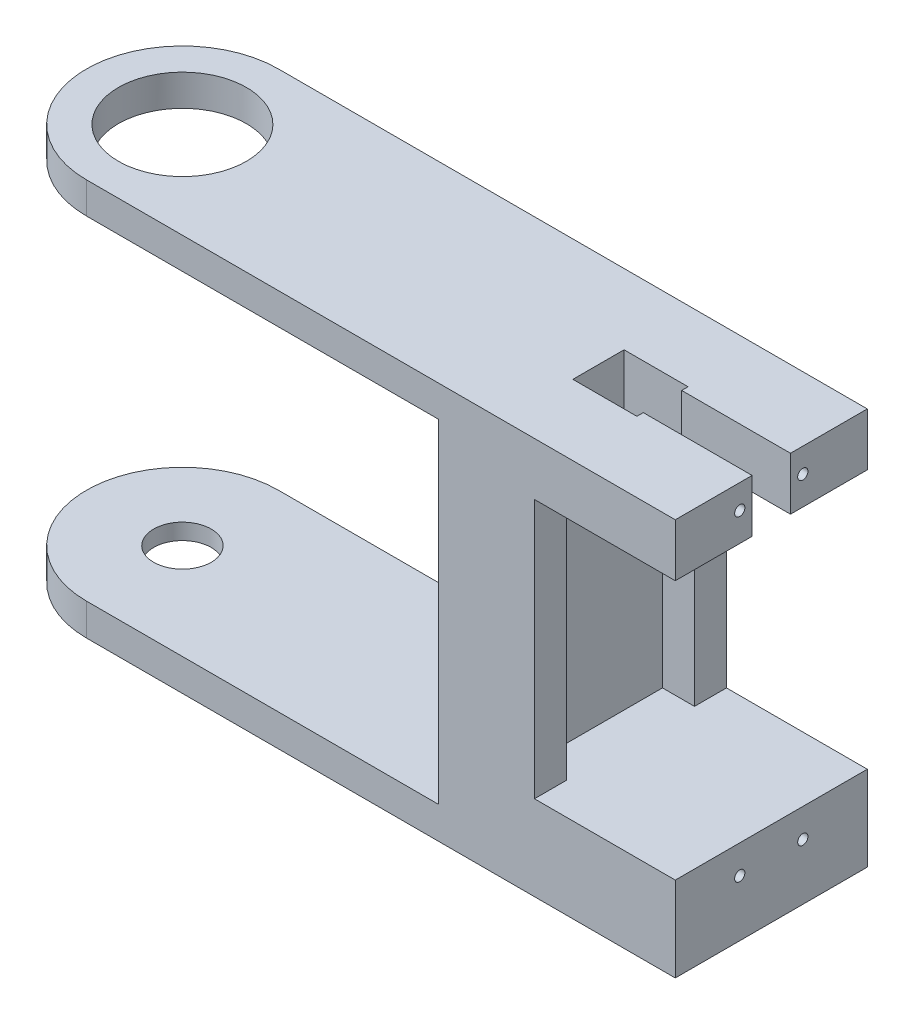
ISO-10303-21;
HEADER;
FILE_DESCRIPTION(('STEP AP214'),'2;1');
FILE_NAME('part.step','',(''),(''),'','','');
FILE_SCHEMA(('AUTOMOTIVE_DESIGN { 1 0 10303 214 1 1 1 1 }'));
ENDSEC;
DATA;
#1=APPLICATION_CONTEXT('core data for automotive mechanical design processes');
#2=APPLICATION_PROTOCOL_DEFINITION('international standard','automotive_design',2000,#1);
#3=PRODUCT_CONTEXT('',#1,'mechanical');
#4=PRODUCT('Part','Part','',(#3));
#5=PRODUCT_RELATED_PRODUCT_CATEGORY('part','',(#4));
#6=PRODUCT_DEFINITION_FORMATION('','',#4);
#7=PRODUCT_DEFINITION_CONTEXT('part definition',#1,'design');
#8=PRODUCT_DEFINITION('design','',#6,#7);
#9=PRODUCT_DEFINITION_SHAPE('','',#8);
#10=(LENGTH_UNIT() NAMED_UNIT(*) SI_UNIT(.MILLI.,.METRE.));
#11=(NAMED_UNIT(*) PLANE_ANGLE_UNIT() SI_UNIT($,.RADIAN.));
#12=(NAMED_UNIT(*) SI_UNIT($,.STERADIAN.) SOLID_ANGLE_UNIT());
#13=UNCERTAINTY_MEASURE_WITH_UNIT(LENGTH_MEASURE(1.E-05),#10,'distance_accuracy_value','');
#14=(GEOMETRIC_REPRESENTATION_CONTEXT(3) GLOBAL_UNCERTAINTY_ASSIGNED_CONTEXT((#13)) GLOBAL_UNIT_ASSIGNED_CONTEXT((#10,
#11,#12)) REPRESENTATION_CONTEXT('',''));
#15=CARTESIAN_POINT('',(0.,0.,0.));
#16=DIRECTION('',(0.,0.,1.));
#17=DIRECTION('',(1.,0.,0.));
#18=AXIS2_PLACEMENT_3D('',#15,#16,#17);
#19=CARTESIAN_POINT('',(-25.55,27.,-97.9443417280656));
#20=DIRECTION('',(0.,1.,0.));
#21=DIRECTION('',(-1.,0.,0.));
#22=AXIS2_PLACEMENT_3D('',#19,#20,#21);
#23=PLANE('',#22);
#24=CARTESIAN_POINT('',(-80.25,27.,15.));
#25=DIRECTION('',(0.,-1.,0.));
#26=DIRECTION('',(1.,0.,0.));
#27=AXIS2_PLACEMENT_3D('',#24,#25,#26);
#28=CIRCLE('',#27,10.5);
#29=CARTESIAN_POINT('',(-69.75,27.,15.));
#30=VERTEX_POINT('',#29);
#31=EDGE_CURVE('E454',#30,#30,#28,.T.);
#32=ORIENTED_EDGE('',*,*,#31,.F.);
#33=EDGE_LOOP('',(#32));
#34=FACE_BOUND('',#33,.T.);
#35=DIRECTION('',(-1.,0.,0.));
#36=VECTOR('',#35,1.);
#37=CARTESIAN_POINT('',(-25.55,27.,30.));
#38=LINE('',#37,#36);
#39=CARTESIAN_POINT('',(11.75,27.,30.));
#40=VERTEX_POINT('',#39);
#41=CARTESIAN_POINT('',(-80.25,27.,30.));
#42=VERTEX_POINT('',#41);
#43=EDGE_CURVE('E238',#40,#42,#38,.T.);
#44=ORIENTED_EDGE('',*,*,#43,.T.);
#45=CARTESIAN_POINT('',(-80.25,27.,15.));
#46=DIRECTION('',(0.,1.,0.));
#47=DIRECTION('',(1.,0.,0.));
#48=AXIS2_PLACEMENT_3D('',#45,#46,#47);
#49=CIRCLE('',#48,15.);
#50=CARTESIAN_POINT('',(-80.25,27.,0.));
#51=VERTEX_POINT('',#50);
#52=EDGE_CURVE('E226',#51,#42,#49,.T.);
#53=ORIENTED_EDGE('',*,*,#52,.F.);
#54=DIRECTION('',(1.,0.,0.));
#55=VECTOR('',#54,1.);
#56=CARTESIAN_POINT('',(-25.55,27.,0.));
#57=LINE('',#56,#55);
#58=CARTESIAN_POINT('',(11.75,27.,0.));
#59=VERTEX_POINT('',#58);
#60=EDGE_CURVE('E235',#51,#59,#57,.T.);
#61=ORIENTED_EDGE('',*,*,#60,.T.);
#62=DIRECTION('',(0.,0.,-1.));
#63=VECTOR('',#62,1.);
#64=CARTESIAN_POINT('',(11.75,27.,0.));
#65=LINE('',#64,#63);
#66=EDGE_CURVE('E286',#40,#59,#65,.T.);
#67=ORIENTED_EDGE('',*,*,#66,.F.);
#68=EDGE_LOOP('',(#44,#53,#61,#67));
#69=FACE_BOUND('',#68,.T.);
#70=ADVANCED_FACE('F49',(#34,#69),#23,.F.);
#71=CARTESIAN_POINT('',(-30.25,89.,-73.8782782690555));
#72=DIRECTION('',(0.,1.,0.));
#73=DIRECTION('',(0.,0.,1.));
#74=AXIS2_PLACEMENT_3D('',#71,#72,#73);
#75=PLANE('',#74);
#76=CARTESIAN_POINT('',(-80.25,89.,15.));
#77=DIRECTION('',(0.,1.,0.));
#78=DIRECTION('',(0.,0.,1.));
#79=AXIS2_PLACEMENT_3D('',#76,#77,#78);
#80=CIRCLE('',#79,10.);
#81=CARTESIAN_POINT('',(-80.25,89.,25.));
#82=VERTEX_POINT('',#81);
#83=EDGE_CURVE('E263',#82,#82,#80,.T.);
#84=ORIENTED_EDGE('',*,*,#83,.F.);
#85=EDGE_LOOP('',(#84));
#86=FACE_BOUND('',#85,.T.);
#87=CARTESIAN_POINT('',(-80.25,89.,15.));
#88=DIRECTION('',(0.,1.,0.));
#89=DIRECTION('',(0.,0.,1.));
#90=AXIS2_PLACEMENT_3D('',#87,#88,#89);
#91=CIRCLE('',#90,15.);
#92=CARTESIAN_POINT('',(-80.25,89.,0.));
#93=VERTEX_POINT('',#92);
#94=CARTESIAN_POINT('',(-80.25,89.,30.));
#95=VERTEX_POINT('',#94);
#96=EDGE_CURVE('E442',#93,#95,#91,.T.);
#97=ORIENTED_EDGE('',*,*,#96,.T.);
#98=DIRECTION('',(-1.,0.,0.));
#99=VECTOR('',#98,1.);
#100=CARTESIAN_POINT('',(-30.25,89.,30.));
#101=LINE('',#100,#99);
#102=CARTESIAN_POINT('',(11.75,89.,30.));
#103=VERTEX_POINT('',#102);
#104=EDGE_CURVE('E250',#103,#95,#101,.T.);
#105=ORIENTED_EDGE('',*,*,#104,.F.);
#106=DIRECTION('',(0.,0.,1.));
#107=VECTOR('',#106,1.);
#108=CARTESIAN_POINT('',(11.75,89.,-73.8782782690555));
#109=LINE('',#108,#107);
#110=CARTESIAN_POINT('',(11.75,89.,18.));
#111=VERTEX_POINT('',#110);
#112=EDGE_CURVE('E243',#111,#103,#109,.T.);
#113=ORIENTED_EDGE('',*,*,#112,.F.);
#114=DIRECTION('',(1.,0.,0.));
#115=VECTOR('',#114,1.);
#116=CARTESIAN_POINT('',(-5.25000000000001,89.,18.));
#117=LINE('',#116,#115);
#118=CARTESIAN_POINT('',(-5.25000000000001,89.,18.));
#119=VERTEX_POINT('',#118);
#120=EDGE_CURVE('E353',#119,#111,#117,.T.);
#121=ORIENTED_EDGE('',*,*,#120,.F.);
#122=DIRECTION('',(0.,0.,-1.));
#123=VECTOR('',#122,1.);
#124=CARTESIAN_POINT('',(-5.25000000000001,89.,19.));
#125=LINE('',#124,#123);
#126=CARTESIAN_POINT('',(-5.25000000000001,89.,19.));
#127=VERTEX_POINT('',#126);
#128=EDGE_CURVE('E376',#127,#119,#125,.T.);
#129=ORIENTED_EDGE('',*,*,#128,.F.);
#130=DIRECTION('',(1.,0.,0.));
#131=VECTOR('',#130,1.);
#132=CARTESIAN_POINT('',(-15.25,89.,19.));
#133=LINE('',#132,#131);
#134=CARTESIAN_POINT('',(-15.25,89.,19.));
#135=VERTEX_POINT('',#134);
#136=EDGE_CURVE('E348',#135,#127,#133,.T.);
#137=ORIENTED_EDGE('',*,*,#136,.F.);
#138=DIRECTION('',(0.,0.,-1.));
#139=VECTOR('',#138,1.);
#140=CARTESIAN_POINT('',(-15.25,89.,19.));
#141=LINE('',#140,#139);
#142=CARTESIAN_POINT('',(-15.25,89.,11.));
#143=VERTEX_POINT('',#142);
#144=EDGE_CURVE('E358',#135,#143,#141,.T.);
#145=ORIENTED_EDGE('',*,*,#144,.T.);
#146=DIRECTION('',(1.,0.,0.));
#147=VECTOR('',#146,1.);
#148=CARTESIAN_POINT('',(-15.25,89.,11.));
#149=LINE('',#148,#147);
#150=CARTESIAN_POINT('',(-5.25000000000001,89.,11.));
#151=VERTEX_POINT('',#150);
#152=EDGE_CURVE('E387',#143,#151,#149,.T.);
#153=ORIENTED_EDGE('',*,*,#152,.T.);
#154=DIRECTION('',(0.,0.,1.));
#155=VECTOR('',#154,1.);
#156=CARTESIAN_POINT('',(-5.25000000000001,89.,11.));
#157=LINE('',#156,#155);
#158=CARTESIAN_POINT('',(-5.25000000000001,89.,12.));
#159=VERTEX_POINT('',#158);
#160=EDGE_CURVE('E383',#151,#159,#157,.T.);
#161=ORIENTED_EDGE('',*,*,#160,.T.);
#162=DIRECTION('',(1.,0.,0.));
#163=VECTOR('',#162,1.);
#164=CARTESIAN_POINT('',(-5.25000000000001,89.,12.));
#165=LINE('',#164,#163);
#166=CARTESIAN_POINT('',(11.75,89.,12.));
#167=VERTEX_POINT('',#166);
#168=EDGE_CURVE('E379',#159,#167,#165,.T.);
#169=ORIENTED_EDGE('',*,*,#168,.T.);
#170=CARTESIAN_POINT('',(11.75,89.,0.));
#171=VERTEX_POINT('',#170);
#172=EDGE_CURVE('E245',#171,#167,#109,.T.);
#173=ORIENTED_EDGE('',*,*,#172,.F.);
#174=DIRECTION('',(1.,0.,0.));
#175=VECTOR('',#174,1.);
#176=CARTESIAN_POINT('',(-30.25,89.,0.));
#177=LINE('',#176,#175);
#178=EDGE_CURVE('E247',#93,#171,#177,.T.);
#179=ORIENTED_EDGE('',*,*,#178,.F.);
#180=EDGE_LOOP('',(#97,#105,#113,#121,#129,#137,#145,#153,#161,#169,#173,#179));
#181=FACE_BOUND('',#180,.T.);
#182=ADVANCED_FACE('F440',(#86,#181),#75,.T.);
#183=CARTESIAN_POINT('',(-95.25,84.1,0.));
#184=DIRECTION('',(0.,1.,0.));
#185=DIRECTION('',(-1.,0.,0.));
#186=AXIS2_PLACEMENT_3D('',#183,#184,#185);
#187=PLANE('',#186);
#188=CARTESIAN_POINT('',(-80.25,84.1,15.));
#189=DIRECTION('',(0.,1.,0.));
#190=DIRECTION('',(-1.,0.,0.));
#191=AXIS2_PLACEMENT_3D('',#188,#189,#190);
#192=CIRCLE('',#191,10.);
#193=CARTESIAN_POINT('',(-90.2500000000001,84.1,15.));
#194=VERTEX_POINT('',#193);
#195=EDGE_CURVE('E257',#194,#194,#192,.F.);
#196=ORIENTED_EDGE('',*,*,#195,.F.);
#197=EDGE_LOOP('',(#196));
#198=FACE_BOUND('',#197,.T.);
#199=DIRECTION('',(1.,0.,0.));
#200=VECTOR('',#199,1.);
#201=CARTESIAN_POINT('',(-95.25,84.1,30.));
#202=LINE('',#201,#200);
#203=CARTESIAN_POINT('',(-80.25,84.1,30.));
#204=VERTEX_POINT('',#203);
#205=CARTESIAN_POINT('',(-25.25,84.1,30.));
#206=VERTEX_POINT('',#205);
#207=EDGE_CURVE('E276',#204,#206,#202,.T.);
#208=ORIENTED_EDGE('',*,*,#207,.F.);
#209=CARTESIAN_POINT('',(-80.25,84.1,15.));
#210=DIRECTION('',(0.,1.,0.));
#211=DIRECTION('',(-1.,0.,0.));
#212=AXIS2_PLACEMENT_3D('',#209,#210,#211);
#213=CIRCLE('',#212,15.);
#214=CARTESIAN_POINT('',(-80.25,84.1,0.));
#215=VERTEX_POINT('',#214);
#216=EDGE_CURVE('E449',#204,#215,#213,.F.);
#217=ORIENTED_EDGE('',*,*,#216,.T.);
#218=DIRECTION('',(1.,0.,0.));
#219=VECTOR('',#218,1.);
#220=CARTESIAN_POINT('',(-95.25,84.1,0.));
#221=LINE('',#220,#219);
#222=CARTESIAN_POINT('',(-25.25,84.1,0.));
#223=VERTEX_POINT('',#222);
#224=EDGE_CURVE('E278',#215,#223,#221,.T.);
#225=ORIENTED_EDGE('',*,*,#224,.T.);
#226=DIRECTION('',(0.,0.,1.));
#227=VECTOR('',#226,1.);
#228=CARTESIAN_POINT('',(-25.25,84.1,0.));
#229=LINE('',#228,#227);
#230=EDGE_CURVE('E273',#223,#206,#229,.T.);
#231=ORIENTED_EDGE('',*,*,#230,.T.);
#232=EDGE_LOOP('',(#208,#217,#225,#231));
#233=FACE_BOUND('',#232,.T.);
#234=ADVANCED_FACE('F477',(#198,#233),#187,.F.);
#235=CARTESIAN_POINT('',(-95.25,32.,0.));
#236=DIRECTION('',(0.,-1.,0.));
#237=DIRECTION('',(1.,0.,0.));
#238=AXIS2_PLACEMENT_3D('',#235,#236,#237);
#239=PLANE('',#238);
#240=CARTESIAN_POINT('',(-80.25,32.,15.));
#241=DIRECTION('',(0.,-1.,0.));
#242=DIRECTION('',(1.,0.,0.));
#243=AXIS2_PLACEMENT_3D('',#240,#241,#242);
#244=CIRCLE('',#243,4.5);
#245=CARTESIAN_POINT('',(-75.75,32.,15.));
#246=VERTEX_POINT('',#245);
#247=EDGE_CURVE('E254',#246,#246,#244,.T.);
#248=ORIENTED_EDGE('',*,*,#247,.T.);
#249=EDGE_LOOP('',(#248));
#250=FACE_BOUND('',#249,.T.);
#251=DIRECTION('',(1.,0.,0.));
#252=VECTOR('',#251,1.);
#253=CARTESIAN_POINT('',(-95.25,32.,0.));
#254=LINE('',#253,#252);
#255=CARTESIAN_POINT('',(-80.25,32.,0.));
#256=VERTEX_POINT('',#255);
#257=CARTESIAN_POINT('',(-25.25,32.,0.));
#258=VERTEX_POINT('',#257);
#259=EDGE_CURVE('E260',#256,#258,#254,.T.);
#260=ORIENTED_EDGE('',*,*,#259,.F.);
#261=CARTESIAN_POINT('',(-80.25,32.,15.));
#262=DIRECTION('',(0.,-1.,0.));
#263=DIRECTION('',(1.,0.,0.));
#264=AXIS2_PLACEMENT_3D('',#261,#262,#263);
#265=CIRCLE('',#264,15.);
#266=CARTESIAN_POINT('',(-80.25,32.,30.));
#267=VERTEX_POINT('',#266);
#268=EDGE_CURVE('E66',#256,#267,#265,.F.);
#269=ORIENTED_EDGE('',*,*,#268,.T.);
#270=DIRECTION('',(1.,0.,0.));
#271=VECTOR('',#270,1.);
#272=CARTESIAN_POINT('',(-95.25,32.,30.));
#273=LINE('',#272,#271);
#274=CARTESIAN_POINT('',(-25.25,32.,30.));
#275=VERTEX_POINT('',#274);
#276=EDGE_CURVE('E71',#267,#275,#273,.T.);
#277=ORIENTED_EDGE('',*,*,#276,.T.);
#278=DIRECTION('',(0.,0.,-1.));
#279=VECTOR('',#278,1.);
#280=CARTESIAN_POINT('',(-25.25,32.,0.));
#281=LINE('',#280,#279);
#282=EDGE_CURVE('E256',#275,#258,#281,.T.);
#283=ORIENTED_EDGE('',*,*,#282,.T.);
#284=EDGE_LOOP('',(#260,#269,#277,#283));
#285=FACE_BOUND('',#284,.T.);
#286=ADVANCED_FACE('F468',(#250,#285),#239,.F.);
#287=CARTESIAN_POINT('',(-80.25,101.727922061358,15.));
#288=DIRECTION('',(0.,-1.,0.));
#289=DIRECTION('',(1.,0.,0.));
#290=AXIS2_PLACEMENT_3D('',#287,#288,#289);
#291=CYLINDRICAL_SURFACE('',#290,4.5);
#292=ORIENTED_EDGE('',*,*,#247,.F.);
#293=EDGE_LOOP('',(#292));
#294=FACE_BOUND('',#293,.T.);
#295=CARTESIAN_POINT('',(-80.25,29.5,15.));
#296=DIRECTION('',(0.,-1.,0.));
#297=DIRECTION('',(1.,0.,0.));
#298=AXIS2_PLACEMENT_3D('',#295,#296,#297);
#299=CIRCLE('',#298,4.5);
#300=CARTESIAN_POINT('',(-75.75,29.5,15.));
#301=VERTEX_POINT('',#300);
#302=EDGE_CURVE('E53',#301,#301,#299,.F.);
#303=ORIENTED_EDGE('',*,*,#302,.F.);
#304=EDGE_LOOP('',(#303));
#305=FACE_BOUND('',#304,.T.);
#306=ADVANCED_FACE('F465',(#294,#305),#291,.F.);
#307=CARTESIAN_POINT('',(-25.25,84.1,82.3393733244868));
#308=DIRECTION('',(1.,0.,0.));
#309=DIRECTION('',(0.,1.,0.));
#310=AXIS2_PLACEMENT_3D('',#307,#308,#309);
#311=PLANE('',#310);
#312=ORIENTED_EDGE('',*,*,#282,.F.);
#313=DIRECTION('',(0.,-1.,0.));
#314=VECTOR('',#313,1.);
#315=CARTESIAN_POINT('',(-25.25,84.1,30.));
#316=LINE('',#315,#314);
#317=EDGE_CURVE('E283',#206,#275,#316,.T.);
#318=ORIENTED_EDGE('',*,*,#317,.F.);
#319=ORIENTED_EDGE('',*,*,#230,.F.);
#320=DIRECTION('',(0.,-1.,0.));
#321=VECTOR('',#320,1.);
#322=CARTESIAN_POINT('',(-25.25,84.1,0.));
#323=LINE('',#322,#321);
#324=EDGE_CURVE('E280',#223,#258,#323,.T.);
#325=ORIENTED_EDGE('',*,*,#324,.T.);
#326=EDGE_LOOP('',(#312,#318,#319,#325));
#327=FACE_BOUND('',#326,.T.);
#328=ADVANCED_FACE('F467',(#327),#311,.F.);
#329=CARTESIAN_POINT('',(0.,0.,30.));
#330=DIRECTION('',(0.,0.,1.));
#331=DIRECTION('',(1.,0.,0.));
#332=AXIS2_PLACEMENT_3D('',#329,#330,#331);
#333=PLANE('',#332);
#334=DIRECTION('',(0.,-1.,0.));
#335=VECTOR('',#334,1.);
#336=CARTESIAN_POINT('',(-80.25,142.493294710747,30.));
#337=LINE('',#336,#335);
#338=EDGE_CURVE('E445',#267,#42,#337,.T.);
#339=ORIENTED_EDGE('',*,*,#338,.T.);
#340=ORIENTED_EDGE('',*,*,#43,.F.);
#341=DIRECTION('',(0.,-1.,0.));
#342=VECTOR('',#341,1.);
#343=CARTESIAN_POINT('',(11.75,40.25,30.));
#344=LINE('',#343,#342);
#345=CARTESIAN_POINT('',(11.75,40.25,30.));
#346=VERTEX_POINT('',#345);
#347=EDGE_CURVE('E406',#346,#40,#344,.T.);
#348=ORIENTED_EDGE('',*,*,#347,.F.);
#349=DIRECTION('',(1.,0.,0.));
#350=VECTOR('',#349,1.);
#351=CARTESIAN_POINT('',(-15.25,40.25,30.));
#352=LINE('',#351,#350);
#353=CARTESIAN_POINT('',(-10.25,40.25,30.));
#354=VERTEX_POINT('',#353);
#355=EDGE_CURVE('E371',#354,#346,#352,.T.);
#356=ORIENTED_EDGE('',*,*,#355,.F.);
#357=DIRECTION('',(0.,-1.,0.));
#358=VECTOR('',#357,1.);
#359=CARTESIAN_POINT('',(-10.25,80.75,30.));
#360=LINE('',#359,#358);
#361=CARTESIAN_POINT('',(-10.25,80.75,30.));
#362=VERTEX_POINT('',#361);
#363=EDGE_CURVE('E333',#362,#354,#360,.T.);
#364=ORIENTED_EDGE('',*,*,#363,.F.);
#365=DIRECTION('',(-1.,0.,0.));
#366=VECTOR('',#365,1.);
#367=CARTESIAN_POINT('',(-15.25,80.75,30.));
#368=LINE('',#367,#366);
#369=CARTESIAN_POINT('',(11.75,80.75,30.));
#370=VERTEX_POINT('',#369);
#371=EDGE_CURVE('E411',#370,#362,#368,.T.);
#372=ORIENTED_EDGE('',*,*,#371,.F.);
#373=DIRECTION('',(0.,-1.,0.));
#374=VECTOR('',#373,1.);
#375=CARTESIAN_POINT('',(11.75,101.149817475309,30.));
#376=LINE('',#375,#374);
#377=EDGE_CURVE('E408',#103,#370,#376,.T.);
#378=ORIENTED_EDGE('',*,*,#377,.F.);
#379=ORIENTED_EDGE('',*,*,#104,.T.);
#380=EDGE_CURVE('E435',#95,#204,#337,.T.);
#381=ORIENTED_EDGE('',*,*,#380,.T.);
#382=ORIENTED_EDGE('',*,*,#207,.T.);
#383=ORIENTED_EDGE('',*,*,#317,.T.);
#384=ORIENTED_EDGE('',*,*,#276,.F.);
#385=EDGE_LOOP('',(#339,#340,#348,#356,#364,#372,#378,#379,#381,#382,#383,#384));
#386=FACE_BOUND('',#385,.T.);
#387=ADVANCED_FACE('F433',(#386),#333,.T.);
#388=CARTESIAN_POINT('',(0.,0.,0.));
#389=DIRECTION('',(0.,0.,1.));
#390=DIRECTION('',(1.,0.,0.));
#391=AXIS2_PLACEMENT_3D('',#388,#389,#390);
#392=PLANE('',#391);
#393=ORIENTED_EDGE('',*,*,#60,.F.);
#394=DIRECTION('',(0.,-1.,0.));
#395=VECTOR('',#394,1.);
#396=CARTESIAN_POINT('',(-80.25,142.493294710747,0.));
#397=LINE('',#396,#395);
#398=EDGE_CURVE('E223',#256,#51,#397,.T.);
#399=ORIENTED_EDGE('',*,*,#398,.F.);
#400=ORIENTED_EDGE('',*,*,#259,.T.);
#401=ORIENTED_EDGE('',*,*,#324,.F.);
#402=ORIENTED_EDGE('',*,*,#224,.F.);
#403=EDGE_CURVE('E230',#93,#215,#397,.T.);
#404=ORIENTED_EDGE('',*,*,#403,.F.);
#405=ORIENTED_EDGE('',*,*,#178,.T.);
#406=DIRECTION('',(0.,1.,0.));
#407=VECTOR('',#406,1.);
#408=CARTESIAN_POINT('',(11.75,101.149817475309,0.));
#409=LINE('',#408,#407);
#410=CARTESIAN_POINT('',(11.75,80.75,0.));
#411=VERTEX_POINT('',#410);
#412=EDGE_CURVE('E398',#411,#171,#409,.T.);
#413=ORIENTED_EDGE('',*,*,#412,.F.);
#414=DIRECTION('',(1.,0.,0.));
#415=VECTOR('',#414,1.);
#416=CARTESIAN_POINT('',(-15.25,80.75,0.));
#417=LINE('',#416,#415);
#418=CARTESIAN_POINT('',(-10.25,80.75,0.));
#419=VERTEX_POINT('',#418);
#420=EDGE_CURVE('E402',#419,#411,#417,.T.);
#421=ORIENTED_EDGE('',*,*,#420,.F.);
#422=DIRECTION('',(0.,1.,0.));
#423=VECTOR('',#422,1.);
#424=CARTESIAN_POINT('',(-10.25,80.75,0.));
#425=LINE('',#424,#423);
#426=CARTESIAN_POINT('',(-10.25,40.25,0.));
#427=VERTEX_POINT('',#426);
#428=EDGE_CURVE('E313',#427,#419,#425,.T.);
#429=ORIENTED_EDGE('',*,*,#428,.F.);
#430=DIRECTION('',(-1.,0.,0.));
#431=VECTOR('',#430,1.);
#432=CARTESIAN_POINT('',(-15.25,40.25,0.));
#433=LINE('',#432,#431);
#434=CARTESIAN_POINT('',(11.75,40.25,0.));
#435=VERTEX_POINT('',#434);
#436=EDGE_CURVE('E404',#435,#427,#433,.T.);
#437=ORIENTED_EDGE('',*,*,#436,.F.);
#438=DIRECTION('',(0.,1.,0.));
#439=VECTOR('',#438,1.);
#440=CARTESIAN_POINT('',(11.75,40.25,0.));
#441=LINE('',#440,#439);
#442=EDGE_CURVE('E241',#59,#435,#441,.T.);
#443=ORIENTED_EDGE('',*,*,#442,.F.);
#444=EDGE_LOOP('',(#393,#399,#400,#401,#402,#404,#405,#413,#421,#429,#437,#443));
#445=FACE_BOUND('',#444,.T.);
#446=ADVANCED_FACE('F51',(#445),#392,.F.);
#447=CARTESIAN_POINT('',(-15.25,80.75,-78.4263811282179));
#448=DIRECTION('',(-1.,0.,0.));
#449=DIRECTION('',(0.,-1.,0.));
#450=AXIS2_PLACEMENT_3D('',#447,#448,#449);
#451=PLANE('',#450);
#452=DIRECTION('',(0.,-1.,0.));
#453=VECTOR('',#452,1.);
#454=CARTESIAN_POINT('',(-15.25,80.75,5.));
#455=LINE('',#454,#453);
#456=CARTESIAN_POINT('',(-15.25,80.75,4.99999999999998));
#457=VERTEX_POINT('',#456);
#458=CARTESIAN_POINT('',(-15.25,40.25,4.99999999999998));
#459=VERTEX_POINT('',#458);
#460=EDGE_CURVE('E312',#457,#459,#455,.T.);
#461=ORIENTED_EDGE('',*,*,#460,.F.);
#462=DIRECTION('',(0.,0.,1.));
#463=VECTOR('',#462,1.);
#464=CARTESIAN_POINT('',(-15.25,80.75,-78.4263811282179));
#465=LINE('',#464,#463);
#466=CARTESIAN_POINT('',(-15.25,80.75,11.));
#467=VERTEX_POINT('',#466);
#468=EDGE_CURVE('E399',#457,#467,#465,.T.);
#469=ORIENTED_EDGE('',*,*,#468,.T.);
#470=DIRECTION('',(0.,-1.,0.));
#471=VECTOR('',#470,1.);
#472=CARTESIAN_POINT('',(-15.25,139.635955604689,11.));
#473=LINE('',#472,#471);
#474=EDGE_CURVE('E374',#143,#467,#473,.T.);
#475=ORIENTED_EDGE('',*,*,#474,.F.);
#476=ORIENTED_EDGE('',*,*,#144,.F.);
#477=DIRECTION('',(0.,-1.,0.));
#478=VECTOR('',#477,1.);
#479=CARTESIAN_POINT('',(-15.25,139.635955604689,19.));
#480=LINE('',#479,#478);
#481=CARTESIAN_POINT('',(-15.25,80.75,19.));
#482=VERTEX_POINT('',#481);
#483=EDGE_CURVE('E367',#135,#482,#480,.T.);
#484=ORIENTED_EDGE('',*,*,#483,.T.);
#485=CARTESIAN_POINT('',(-15.25,80.75,25.));
#486=VERTEX_POINT('',#485);
#487=EDGE_CURVE('E416',#482,#486,#465,.T.);
#488=ORIENTED_EDGE('',*,*,#487,.T.);
#489=DIRECTION('',(0.,1.,0.));
#490=VECTOR('',#489,1.);
#491=CARTESIAN_POINT('',(-15.25,80.75,25.));
#492=LINE('',#491,#490);
#493=CARTESIAN_POINT('',(-15.25,40.25,25.));
#494=VERTEX_POINT('',#493);
#495=EDGE_CURVE('E332',#494,#486,#492,.T.);
#496=ORIENTED_EDGE('',*,*,#495,.F.);
#497=DIRECTION('',(0.,0.,1.));
#498=VECTOR('',#497,1.);
#499=CARTESIAN_POINT('',(-15.25,40.25,-78.4263811282179));
#500=LINE('',#499,#498);
#501=EDGE_CURVE('E414',#459,#494,#500,.T.);
#502=ORIENTED_EDGE('',*,*,#501,.F.);
#503=EDGE_LOOP('',(#461,#469,#475,#476,#484,#488,#496,#502));
#504=FACE_BOUND('',#503,.T.);
#505=ADVANCED_FACE('F494',(#504),#451,.F.);
#506=CARTESIAN_POINT('',(-15.25,40.25,-78.4263811282179));
#507=DIRECTION('',(0.,-1.,0.));
#508=DIRECTION('',(1.,0.,0.));
#509=AXIS2_PLACEMENT_3D('',#506,#507,#508);
#510=PLANE('',#509);
#511=DIRECTION('',(-1.,0.,0.));
#512=VECTOR('',#511,1.);
#513=CARTESIAN_POINT('',(-10.25,40.25,5.));
#514=LINE('',#513,#512);
#515=CARTESIAN_POINT('',(-10.25,40.25,5.));
#516=VERTEX_POINT('',#515);
#517=EDGE_CURVE('E325',#516,#459,#514,.T.);
#518=ORIENTED_EDGE('',*,*,#517,.T.);
#519=ORIENTED_EDGE('',*,*,#501,.T.);
#520=DIRECTION('',(-1.,0.,0.));
#521=VECTOR('',#520,1.);
#522=CARTESIAN_POINT('',(-10.25,40.25,25.));
#523=LINE('',#522,#521);
#524=CARTESIAN_POINT('',(-10.25,40.25,25.));
#525=VERTEX_POINT('',#524);
#526=EDGE_CURVE('E345',#525,#494,#523,.T.);
#527=ORIENTED_EDGE('',*,*,#526,.F.);
#528=DIRECTION('',(0.,0.,-1.));
#529=VECTOR('',#528,1.);
#530=CARTESIAN_POINT('',(-10.25,40.25,30.));
#531=LINE('',#530,#529);
#532=EDGE_CURVE('E335',#354,#525,#531,.T.);
#533=ORIENTED_EDGE('',*,*,#532,.F.);
#534=ORIENTED_EDGE('',*,*,#355,.T.);
#535=DIRECTION('',(0.,0.,1.));
#536=VECTOR('',#535,1.);
#537=CARTESIAN_POINT('',(11.75,40.25,-78.4263811282179));
#538=LINE('',#537,#536);
#539=EDGE_CURVE('E421',#435,#346,#538,.T.);
#540=ORIENTED_EDGE('',*,*,#539,.F.);
#541=ORIENTED_EDGE('',*,*,#436,.T.);
#542=DIRECTION('',(0.,0.,-1.));
#543=VECTOR('',#542,1.);
#544=CARTESIAN_POINT('',(-10.25,40.25,0.));
#545=LINE('',#544,#543);
#546=EDGE_CURVE('E322',#516,#427,#545,.T.);
#547=ORIENTED_EDGE('',*,*,#546,.F.);
#548=EDGE_LOOP('',(#518,#519,#527,#533,#534,#540,#541,#547));
#549=FACE_BOUND('',#548,.T.);
#550=ADVANCED_FACE('F498',(#549),#510,.F.);
#551=CARTESIAN_POINT('',(-15.25,80.75,-78.4263811282179));
#552=DIRECTION('',(0.,1.,0.));
#553=DIRECTION('',(0.,0.,1.));
#554=AXIS2_PLACEMENT_3D('',#551,#552,#553);
#555=PLANE('',#554);
#556=DIRECTION('',(-1.,0.,0.));
#557=VECTOR('',#556,1.);
#558=CARTESIAN_POINT('',(-10.25,80.75,5.));
#559=LINE('',#558,#557);
#560=CARTESIAN_POINT('',(-10.25,80.75,5.));
#561=VERTEX_POINT('',#560);
#562=EDGE_CURVE('E329',#561,#457,#559,.T.);
#563=ORIENTED_EDGE('',*,*,#562,.F.);
#564=DIRECTION('',(0.,0.,1.));
#565=VECTOR('',#564,1.);
#566=CARTESIAN_POINT('',(-10.25,80.75,0.));
#567=LINE('',#566,#565);
#568=EDGE_CURVE('E316',#419,#561,#567,.T.);
#569=ORIENTED_EDGE('',*,*,#568,.F.);
#570=ORIENTED_EDGE('',*,*,#420,.T.);
#571=DIRECTION('',(0.,0.,1.));
#572=VECTOR('',#571,1.);
#573=CARTESIAN_POINT('',(11.75,80.75,-78.4263811282179));
#574=LINE('',#573,#572);
#575=CARTESIAN_POINT('',(11.75,80.75,12.));
#576=VERTEX_POINT('',#575);
#577=EDGE_CURVE('E417',#411,#576,#574,.T.);
#578=ORIENTED_EDGE('',*,*,#577,.T.);
#579=DIRECTION('',(1.,0.,0.));
#580=VECTOR('',#579,1.);
#581=CARTESIAN_POINT('',(-5.25000000000001,80.75,12.));
#582=LINE('',#581,#580);
#583=CARTESIAN_POINT('',(-5.25000000000001,80.75,12.));
#584=VERTEX_POINT('',#583);
#585=EDGE_CURVE('E356',#584,#576,#582,.T.);
#586=ORIENTED_EDGE('',*,*,#585,.F.);
#587=DIRECTION('',(0.,0.,1.));
#588=VECTOR('',#587,1.);
#589=CARTESIAN_POINT('',(-5.25000000000001,80.75,11.));
#590=LINE('',#589,#588);
#591=CARTESIAN_POINT('',(-5.25000000000001,80.75,11.));
#592=VERTEX_POINT('',#591);
#593=EDGE_CURVE('E352',#592,#584,#590,.T.);
#594=ORIENTED_EDGE('',*,*,#593,.F.);
#595=DIRECTION('',(1.,0.,0.));
#596=VECTOR('',#595,1.);
#597=CARTESIAN_POINT('',(-15.25,80.75,11.));
#598=LINE('',#597,#596);
#599=EDGE_CURVE('E349',#467,#592,#598,.T.);
#600=ORIENTED_EDGE('',*,*,#599,.F.);
#601=ORIENTED_EDGE('',*,*,#468,.F.);
#602=EDGE_LOOP('',(#563,#569,#570,#578,#586,#594,#600,#601));
#603=FACE_BOUND('',#602,.T.);
#604=ADVANCED_FACE('F503',(#603),#555,.F.);
#605=DIRECTION('',(-1.,0.,0.));
#606=VECTOR('',#605,1.);
#607=CARTESIAN_POINT('',(-10.25,80.75,25.));
#608=LINE('',#607,#606);
#609=CARTESIAN_POINT('',(-10.25,80.75,25.));
#610=VERTEX_POINT('',#609);
#611=EDGE_CURVE('E341',#610,#486,#608,.T.);
#612=ORIENTED_EDGE('',*,*,#611,.T.);
#613=ORIENTED_EDGE('',*,*,#487,.F.);
#614=DIRECTION('',(1.,0.,0.));
#615=VECTOR('',#614,1.);
#616=CARTESIAN_POINT('',(-15.25,80.75,19.));
#617=LINE('',#616,#615);
#618=CARTESIAN_POINT('',(-5.25000000000001,80.75,19.));
#619=VERTEX_POINT('',#618);
#620=EDGE_CURVE('E368',#482,#619,#617,.T.);
#621=ORIENTED_EDGE('',*,*,#620,.T.);
#622=DIRECTION('',(0.,0.,-1.));
#623=VECTOR('',#622,1.);
#624=CARTESIAN_POINT('',(-5.25000000000001,80.75,19.));
#625=LINE('',#624,#623);
#626=CARTESIAN_POINT('',(-5.25000000000001,80.75,18.));
#627=VERTEX_POINT('',#626);
#628=EDGE_CURVE('E364',#619,#627,#625,.T.);
#629=ORIENTED_EDGE('',*,*,#628,.T.);
#630=DIRECTION('',(1.,0.,0.));
#631=VECTOR('',#630,1.);
#632=CARTESIAN_POINT('',(-5.25000000000001,80.75,18.));
#633=LINE('',#632,#631);
#634=CARTESIAN_POINT('',(11.75,80.75,18.));
#635=VERTEX_POINT('',#634);
#636=EDGE_CURVE('E359',#627,#635,#633,.T.);
#637=ORIENTED_EDGE('',*,*,#636,.T.);
#638=EDGE_CURVE('E420',#635,#370,#574,.T.);
#639=ORIENTED_EDGE('',*,*,#638,.T.);
#640=ORIENTED_EDGE('',*,*,#371,.T.);
#641=DIRECTION('',(0.,0.,1.));
#642=VECTOR('',#641,1.);
#643=CARTESIAN_POINT('',(-10.25,80.75,30.));
#644=LINE('',#643,#642);
#645=EDGE_CURVE('E339',#610,#362,#644,.T.);
#646=ORIENTED_EDGE('',*,*,#645,.F.);
#647=EDGE_LOOP('',(#612,#613,#621,#629,#637,#639,#640,#646));
#648=FACE_BOUND('',#647,.T.);
#649=ADVANCED_FACE('F519',(#648),#555,.F.);
#650=CARTESIAN_POINT('',(11.75,101.149817475309,-78.4263811282179));
#651=DIRECTION('',(-1.,0.,0.));
#652=DIRECTION('',(0.,0.,1.));
#653=AXIS2_PLACEMENT_3D('',#650,#651,#652);
#654=PLANE('',#653);
#655=CARTESIAN_POINT('',(11.75,85.21,19.925));
#656=DIRECTION('',(1.,0.,0.));
#657=DIRECTION('',(0.,0.,-1.));
#658=AXIS2_PLACEMENT_3D('',#655,#656,#657);
#659=CIRCLE('',#658,0.799999999999995);
#660=CARTESIAN_POINT('',(11.75,85.21,19.125));
#661=VERTEX_POINT('',#660);
#662=EDGE_CURVE('E288',#661,#661,#659,.T.);
#663=ORIENTED_EDGE('',*,*,#662,.F.);
#664=EDGE_LOOP('',(#663));
#665=FACE_BOUND('',#664,.T.);
#666=DIRECTION('',(0.,-1.,0.));
#667=VECTOR('',#666,1.);
#668=CARTESIAN_POINT('',(11.75,101.149817475309,18.));
#669=LINE('',#668,#667);
#670=EDGE_CURVE('E58',#111,#635,#669,.T.);
#671=ORIENTED_EDGE('',*,*,#670,.F.);
#672=ORIENTED_EDGE('',*,*,#112,.T.);
#673=ORIENTED_EDGE('',*,*,#377,.T.);
#674=ORIENTED_EDGE('',*,*,#638,.F.);
#675=EDGE_LOOP('',(#671,#672,#673,#674));
#676=FACE_BOUND('',#675,.T.);
#677=ADVANCED_FACE('F515',(#665,#676),#654,.F.);
#678=CARTESIAN_POINT('',(11.75,85.21,10.075));
#679=DIRECTION('',(1.,0.,0.));
#680=DIRECTION('',(0.,0.,-1.));
#681=AXIS2_PLACEMENT_3D('',#678,#679,#680);
#682=CIRCLE('',#681,0.799999999999995);
#683=CARTESIAN_POINT('',(11.75,85.21,9.275));
#684=VERTEX_POINT('',#683);
#685=EDGE_CURVE('E294',#684,#684,#682,.T.);
#686=ORIENTED_EDGE('',*,*,#685,.F.);
#687=EDGE_LOOP('',(#686));
#688=FACE_BOUND('',#687,.T.);
#689=ORIENTED_EDGE('',*,*,#172,.T.);
#690=DIRECTION('',(0.,-1.,0.));
#691=VECTOR('',#690,1.);
#692=CARTESIAN_POINT('',(11.75,101.149817475309,12.));
#693=LINE('',#692,#691);
#694=EDGE_CURVE('E12',#167,#576,#693,.T.);
#695=ORIENTED_EDGE('',*,*,#694,.T.);
#696=ORIENTED_EDGE('',*,*,#577,.F.);
#697=ORIENTED_EDGE('',*,*,#412,.T.);
#698=EDGE_LOOP('',(#689,#695,#696,#697));
#699=FACE_BOUND('',#698,.T.);
#700=ADVANCED_FACE('F511',(#688,#699),#654,.F.);
#701=CARTESIAN_POINT('',(11.75,40.25,-78.4263811282179));
#702=DIRECTION('',(-1.,0.,0.));
#703=DIRECTION('',(0.,-1.,0.));
#704=AXIS2_PLACEMENT_3D('',#701,#702,#703);
#705=PLANE('',#704);
#706=CARTESIAN_POINT('',(11.75,35.79,10.075));
#707=DIRECTION('',(1.,0.,0.));
#708=DIRECTION('',(0.,0.,-1.));
#709=AXIS2_PLACEMENT_3D('',#706,#707,#708);
#710=CIRCLE('',#709,0.799999999999988);
#711=CARTESIAN_POINT('',(11.75,35.79,9.275));
#712=VERTEX_POINT('',#711);
#713=EDGE_CURVE('E300',#712,#712,#710,.T.);
#714=ORIENTED_EDGE('',*,*,#713,.F.);
#715=EDGE_LOOP('',(#714));
#716=FACE_BOUND('',#715,.T.);
#717=CARTESIAN_POINT('',(11.75,35.79,19.925));
#718=DIRECTION('',(1.,0.,0.));
#719=DIRECTION('',(0.,0.,-1.));
#720=AXIS2_PLACEMENT_3D('',#717,#718,#719);
#721=CIRCLE('',#720,0.799999999999988);
#722=CARTESIAN_POINT('',(11.75,35.79,19.125));
#723=VERTEX_POINT('',#722);
#724=EDGE_CURVE('E306',#723,#723,#721,.T.);
#725=ORIENTED_EDGE('',*,*,#724,.F.);
#726=EDGE_LOOP('',(#725));
#727=FACE_BOUND('',#726,.T.);
#728=ORIENTED_EDGE('',*,*,#442,.T.);
#729=ORIENTED_EDGE('',*,*,#539,.T.);
#730=ORIENTED_EDGE('',*,*,#347,.T.);
#731=ORIENTED_EDGE('',*,*,#66,.T.);
#732=EDGE_LOOP('',(#728,#729,#730,#731));
#733=FACE_BOUND('',#732,.T.);
#734=ADVANCED_FACE('F507',(#716,#727,#733),#705,.F.);
#735=CARTESIAN_POINT('',(-5.25000000000001,139.635955604689,12.));
#736=DIRECTION('',(0.,0.,-1.));
#737=DIRECTION('',(-1.,0.,0.));
#738=AXIS2_PLACEMENT_3D('',#735,#736,#737);
#739=PLANE('',#738);
#740=ORIENTED_EDGE('',*,*,#168,.F.);
#741=DIRECTION('',(0.,-1.,0.));
#742=VECTOR('',#741,1.);
#743=CARTESIAN_POINT('',(-5.25000000000001,139.635955604689,12.));
#744=LINE('',#743,#742);
#745=EDGE_CURVE('E382',#159,#584,#744,.T.);
#746=ORIENTED_EDGE('',*,*,#745,.T.);
#747=ORIENTED_EDGE('',*,*,#585,.T.);
#748=ORIENTED_EDGE('',*,*,#694,.F.);
#749=EDGE_LOOP('',(#740,#746,#747,#748));
#750=FACE_BOUND('',#749,.T.);
#751=ADVANCED_FACE('F510',(#750),#739,.F.);
#752=CARTESIAN_POINT('',(-5.25000000000001,139.635955604689,18.));
#753=DIRECTION('',(0.,0.,-1.));
#754=DIRECTION('',(-1.,0.,0.));
#755=AXIS2_PLACEMENT_3D('',#752,#753,#754);
#756=PLANE('',#755);
#757=ORIENTED_EDGE('',*,*,#670,.T.);
#758=ORIENTED_EDGE('',*,*,#636,.F.);
#759=DIRECTION('',(0.,-1.,0.));
#760=VECTOR('',#759,1.);
#761=CARTESIAN_POINT('',(-5.25000000000001,139.635955604689,18.));
#762=LINE('',#761,#760);
#763=EDGE_CURVE('E363',#119,#627,#762,.T.);
#764=ORIENTED_EDGE('',*,*,#763,.F.);
#765=ORIENTED_EDGE('',*,*,#120,.T.);
#766=EDGE_LOOP('',(#757,#758,#764,#765));
#767=FACE_BOUND('',#766,.T.);
#768=ADVANCED_FACE('F525',(#767),#756,.T.);
#769=CARTESIAN_POINT('',(-15.25,139.635955604689,11.));
#770=DIRECTION('',(0.,0.,-1.));
#771=DIRECTION('',(-1.,0.,0.));
#772=AXIS2_PLACEMENT_3D('',#769,#770,#771);
#773=PLANE('',#772);
#774=ORIENTED_EDGE('',*,*,#474,.T.);
#775=ORIENTED_EDGE('',*,*,#599,.T.);
#776=DIRECTION('',(0.,-1.,0.));
#777=VECTOR('',#776,1.);
#778=CARTESIAN_POINT('',(-5.25000000000001,139.635955604689,11.));
#779=LINE('',#778,#777);
#780=EDGE_CURVE('E386',#151,#592,#779,.T.);
#781=ORIENTED_EDGE('',*,*,#780,.F.);
#782=ORIENTED_EDGE('',*,*,#152,.F.);
#783=EDGE_LOOP('',(#774,#775,#781,#782));
#784=FACE_BOUND('',#783,.T.);
#785=ADVANCED_FACE('F521',(#784),#773,.F.);
#786=CARTESIAN_POINT('',(-5.25000000000001,139.635955604689,11.));
#787=DIRECTION('',(1.,0.,0.));
#788=DIRECTION('',(0.,0.,-1.));
#789=AXIS2_PLACEMENT_3D('',#786,#787,#788);
#790=PLANE('',#789);
#791=ORIENTED_EDGE('',*,*,#780,.T.);
#792=ORIENTED_EDGE('',*,*,#593,.T.);
#793=ORIENTED_EDGE('',*,*,#745,.F.);
#794=ORIENTED_EDGE('',*,*,#160,.F.);
#795=EDGE_LOOP('',(#791,#792,#793,#794));
#796=FACE_BOUND('',#795,.T.);
#797=ADVANCED_FACE('F524',(#796),#790,.F.);
#798=CARTESIAN_POINT('',(-5.25000000000001,139.635955604689,19.));
#799=DIRECTION('',(-1.,0.,0.));
#800=DIRECTION('',(0.,0.,1.));
#801=AXIS2_PLACEMENT_3D('',#798,#799,#800);
#802=PLANE('',#801);
#803=ORIENTED_EDGE('',*,*,#128,.T.);
#804=ORIENTED_EDGE('',*,*,#763,.T.);
#805=ORIENTED_EDGE('',*,*,#628,.F.);
#806=DIRECTION('',(0.,-1.,0.));
#807=VECTOR('',#806,1.);
#808=CARTESIAN_POINT('',(-5.25000000000001,139.635955604689,19.));
#809=LINE('',#808,#807);
#810=EDGE_CURVE('E362',#127,#619,#809,.T.);
#811=ORIENTED_EDGE('',*,*,#810,.F.);
#812=EDGE_LOOP('',(#803,#804,#805,#811));
#813=FACE_BOUND('',#812,.T.);
#814=ADVANCED_FACE('F529',(#813),#802,.T.);
#815=CARTESIAN_POINT('',(-15.25,139.635955604689,19.));
#816=DIRECTION('',(0.,0.,-1.));
#817=DIRECTION('',(-1.,0.,0.));
#818=AXIS2_PLACEMENT_3D('',#815,#816,#817);
#819=PLANE('',#818);
#820=ORIENTED_EDGE('',*,*,#136,.T.);
#821=ORIENTED_EDGE('',*,*,#810,.T.);
#822=ORIENTED_EDGE('',*,*,#620,.F.);
#823=ORIENTED_EDGE('',*,*,#483,.F.);
#824=EDGE_LOOP('',(#820,#821,#822,#823));
#825=FACE_BOUND('',#824,.T.);
#826=ADVANCED_FACE('F539',(#825),#819,.T.);
#827=CARTESIAN_POINT('',(-10.25,80.75,25.));
#828=DIRECTION('',(0.,0.,1.));
#829=DIRECTION('',(0.,-1.,0.));
#830=AXIS2_PLACEMENT_3D('',#827,#828,#829);
#831=PLANE('',#830);
#832=ORIENTED_EDGE('',*,*,#495,.T.);
#833=ORIENTED_EDGE('',*,*,#611,.F.);
#834=DIRECTION('',(0.,1.,0.));
#835=VECTOR('',#834,1.);
#836=CARTESIAN_POINT('',(-10.25,80.75,25.));
#837=LINE('',#836,#835);
#838=EDGE_CURVE('E337',#525,#610,#837,.T.);
#839=ORIENTED_EDGE('',*,*,#838,.F.);
#840=ORIENTED_EDGE('',*,*,#526,.T.);
#841=EDGE_LOOP('',(#832,#833,#839,#840));
#842=FACE_BOUND('',#841,.T.);
#843=ADVANCED_FACE('F543',(#842),#831,.F.);
#844=CARTESIAN_POINT('',(-10.25,0.,0.));
#845=DIRECTION('',(1.,0.,0.));
#846=DIRECTION('',(0.,1.,0.));
#847=AXIS2_PLACEMENT_3D('',#844,#845,#846);
#848=PLANE('',#847);
#849=ORIENTED_EDGE('',*,*,#363,.T.);
#850=ORIENTED_EDGE('',*,*,#532,.T.);
#851=ORIENTED_EDGE('',*,*,#838,.T.);
#852=ORIENTED_EDGE('',*,*,#645,.T.);
#853=EDGE_LOOP('',(#849,#850,#851,#852));
#854=FACE_BOUND('',#853,.T.);
#855=ADVANCED_FACE('F547',(#854),#848,.T.);
#856=CARTESIAN_POINT('',(-10.25,80.75,5.));
#857=DIRECTION('',(0.,0.,-1.));
#858=DIRECTION('',(0.,1.,0.));
#859=AXIS2_PLACEMENT_3D('',#856,#857,#858);
#860=PLANE('',#859);
#861=ORIENTED_EDGE('',*,*,#460,.T.);
#862=ORIENTED_EDGE('',*,*,#517,.F.);
#863=DIRECTION('',(0.,-1.,0.));
#864=VECTOR('',#863,1.);
#865=CARTESIAN_POINT('',(-10.25,80.75,5.));
#866=LINE('',#865,#864);
#867=EDGE_CURVE('E319',#561,#516,#866,.T.);
#868=ORIENTED_EDGE('',*,*,#867,.F.);
#869=ORIENTED_EDGE('',*,*,#562,.T.);
#870=EDGE_LOOP('',(#861,#862,#868,#869));
#871=FACE_BOUND('',#870,.T.);
#872=ADVANCED_FACE('F551',(#871),#860,.F.);
#873=CARTESIAN_POINT('',(-10.25,0.,0.));
#874=DIRECTION('',(-1.,0.,0.));
#875=DIRECTION('',(0.,-1.,0.));
#876=AXIS2_PLACEMENT_3D('',#873,#874,#875);
#877=PLANE('',#876);
#878=ORIENTED_EDGE('',*,*,#428,.T.);
#879=ORIENTED_EDGE('',*,*,#568,.T.);
#880=ORIENTED_EDGE('',*,*,#867,.T.);
#881=ORIENTED_EDGE('',*,*,#546,.T.);
#882=EDGE_LOOP('',(#878,#879,#880,#881));
#883=FACE_BOUND('',#882,.T.);
#884=ADVANCED_FACE('F555',(#883),#877,.F.);
#885=CARTESIAN_POINT('',(-5.25,35.79,19.925));
#886=DIRECTION('',(1.,0.,0.));
#887=DIRECTION('',(0.,0.,-1.));
#888=AXIS2_PLACEMENT_3D('',#885,#886,#887);
#889=CONICAL_SURFACE('',#888,0.799999999999988,1.02974425867664);
#890=CARTESIAN_POINT('',(-5.73068849522205,35.79,19.925));
#891=VERTEX_POINT('',#890);
#892=VERTEX_LOOP('',#891);
#893=FACE_BOUND('',#892,.T.);
#894=CARTESIAN_POINT('',(-5.25,35.79,19.925));
#895=DIRECTION('',(1.,0.,0.));
#896=DIRECTION('',(0.,0.,-1.));
#897=AXIS2_PLACEMENT_3D('',#894,#895,#896);
#898=CIRCLE('',#897,0.799999999999988);
#899=CARTESIAN_POINT('',(-5.25,35.79,19.125));
#900=VERTEX_POINT('',#899);
#901=EDGE_CURVE('E309',#900,#900,#898,.T.);
#902=ORIENTED_EDGE('',*,*,#901,.T.);
#903=EDGE_LOOP('',(#902));
#904=FACE_BOUND('',#903,.T.);
#905=ADVANCED_FACE('F559',(#893,#904),#889,.F.);
#906=CARTESIAN_POINT('',(11.75,35.79,19.925));
#907=DIRECTION('',(1.,0.,0.));
#908=DIRECTION('',(0.,0.,-1.));
#909=AXIS2_PLACEMENT_3D('',#906,#907,#908);
#910=CYLINDRICAL_SURFACE('',#909,0.799999999999988);
#911=ORIENTED_EDGE('',*,*,#901,.F.);
#912=EDGE_LOOP('',(#911));
#913=FACE_BOUND('',#912,.T.);
#914=ORIENTED_EDGE('',*,*,#724,.T.);
#915=EDGE_LOOP('',(#914));
#916=FACE_BOUND('',#915,.T.);
#917=ADVANCED_FACE('F563',(#913,#916),#910,.F.);
#918=CARTESIAN_POINT('',(-5.25,35.79,10.075));
#919=DIRECTION('',(1.,0.,0.));
#920=DIRECTION('',(0.,0.,-1.));
#921=AXIS2_PLACEMENT_3D('',#918,#919,#920);
#922=CONICAL_SURFACE('',#921,0.799999999999988,1.02974425867664);
#923=CARTESIAN_POINT('',(-5.73068849522205,35.79,10.075));
#924=VERTEX_POINT('',#923);
#925=VERTEX_LOOP('',#924);
#926=FACE_BOUND('',#925,.T.);
#927=CARTESIAN_POINT('',(-5.25,35.79,10.075));
#928=DIRECTION('',(1.,0.,0.));
#929=DIRECTION('',(0.,0.,-1.));
#930=AXIS2_PLACEMENT_3D('',#927,#928,#929);
#931=CIRCLE('',#930,0.799999999999988);
#932=CARTESIAN_POINT('',(-5.25,35.79,9.275));
#933=VERTEX_POINT('',#932);
#934=EDGE_CURVE('E303',#933,#933,#931,.T.);
#935=ORIENTED_EDGE('',*,*,#934,.T.);
#936=EDGE_LOOP('',(#935));
#937=FACE_BOUND('',#936,.T.);
#938=ADVANCED_FACE('F567',(#926,#937),#922,.F.);
#939=CARTESIAN_POINT('',(11.75,35.79,10.075));
#940=DIRECTION('',(1.,0.,0.));
#941=DIRECTION('',(0.,0.,-1.));
#942=AXIS2_PLACEMENT_3D('',#939,#940,#941);
#943=CYLINDRICAL_SURFACE('',#942,0.799999999999988);
#944=ORIENTED_EDGE('',*,*,#934,.F.);
#945=EDGE_LOOP('',(#944));
#946=FACE_BOUND('',#945,.T.);
#947=ORIENTED_EDGE('',*,*,#713,.T.);
#948=EDGE_LOOP('',(#947));
#949=FACE_BOUND('',#948,.T.);
#950=ADVANCED_FACE('F571',(#946,#949),#943,.F.);
#951=CARTESIAN_POINT('',(-5.25000000000001,85.21,10.075));
#952=DIRECTION('',(1.,0.,0.));
#953=DIRECTION('',(0.,0.,-1.));
#954=AXIS2_PLACEMENT_3D('',#951,#952,#953);
#955=CONICAL_SURFACE('',#954,0.799999999999981,1.02974425867664);
#956=CARTESIAN_POINT('',(-5.73068849522206,85.21,10.075));
#957=VERTEX_POINT('',#956);
#958=VERTEX_LOOP('',#957);
#959=FACE_BOUND('',#958,.T.);
#960=CARTESIAN_POINT('',(-5.25000000000001,85.21,10.075));
#961=DIRECTION('',(1.,0.,0.));
#962=DIRECTION('',(0.,0.,-1.));
#963=AXIS2_PLACEMENT_3D('',#960,#961,#962);
#964=CIRCLE('',#963,0.799999999999981);
#965=CARTESIAN_POINT('',(-5.25000000000001,85.21,9.27500000000001));
#966=VERTEX_POINT('',#965);
#967=EDGE_CURVE('E297',#966,#966,#964,.T.);
#968=ORIENTED_EDGE('',*,*,#967,.T.);
#969=EDGE_LOOP('',(#968));
#970=FACE_BOUND('',#969,.T.);
#971=ADVANCED_FACE('F575',(#959,#970),#955,.F.);
#972=CARTESIAN_POINT('',(11.75,85.21,10.075));
#973=DIRECTION('',(1.,0.,0.));
#974=DIRECTION('',(0.,0.,-1.));
#975=AXIS2_PLACEMENT_3D('',#972,#973,#974);
#976=CYLINDRICAL_SURFACE('',#975,0.799999999999988);
#977=ORIENTED_EDGE('',*,*,#967,.F.);
#978=EDGE_LOOP('',(#977));
#979=FACE_BOUND('',#978,.T.);
#980=ORIENTED_EDGE('',*,*,#685,.T.);
#981=EDGE_LOOP('',(#980));
#982=FACE_BOUND('',#981,.T.);
#983=ADVANCED_FACE('F579',(#979,#982),#976,.F.);
#984=CARTESIAN_POINT('',(-5.25000000000001,85.21,19.925));
#985=DIRECTION('',(1.,0.,0.));
#986=DIRECTION('',(0.,0.,-1.));
#987=AXIS2_PLACEMENT_3D('',#984,#985,#986);
#988=CONICAL_SURFACE('',#987,0.799999999999981,1.02974425867664);
#989=CARTESIAN_POINT('',(-5.73068849522206,85.21,19.925));
#990=VERTEX_POINT('',#989);
#991=VERTEX_LOOP('',#990);
#992=FACE_BOUND('',#991,.T.);
#993=CARTESIAN_POINT('',(-5.25000000000001,85.21,19.925));
#994=DIRECTION('',(1.,0.,0.));
#995=DIRECTION('',(0.,0.,-1.));
#996=AXIS2_PLACEMENT_3D('',#993,#994,#995);
#997=CIRCLE('',#996,0.799999999999981);
#998=CARTESIAN_POINT('',(-5.25000000000001,85.21,19.125));
#999=VERTEX_POINT('',#998);
#1000=EDGE_CURVE('E291',#999,#999,#997,.T.);
#1001=ORIENTED_EDGE('',*,*,#1000,.T.);
#1002=EDGE_LOOP('',(#1001));
#1003=FACE_BOUND('',#1002,.T.);
#1004=ADVANCED_FACE('F583',(#992,#1003),#988,.F.);
#1005=CARTESIAN_POINT('',(11.75,85.21,19.925));
#1006=DIRECTION('',(1.,0.,0.));
#1007=DIRECTION('',(0.,0.,-1.));
#1008=AXIS2_PLACEMENT_3D('',#1005,#1006,#1007);
#1009=CYLINDRICAL_SURFACE('',#1008,0.799999999999988);
#1010=ORIENTED_EDGE('',*,*,#1000,.F.);
#1011=EDGE_LOOP('',(#1010));
#1012=FACE_BOUND('',#1011,.T.);
#1013=ORIENTED_EDGE('',*,*,#662,.T.);
#1014=EDGE_LOOP('',(#1013));
#1015=FACE_BOUND('',#1014,.T.);
#1016=ADVANCED_FACE('F587',(#1012,#1015),#1009,.F.);
#1017=CARTESIAN_POINT('',(-80.25,55.8157287525381,15.));
#1018=DIRECTION('',(0.,1.,0.));
#1019=DIRECTION('',(0.,0.,1.));
#1020=AXIS2_PLACEMENT_3D('',#1017,#1018,#1019);
#1021=CYLINDRICAL_SURFACE('',#1020,10.);
#1022=ORIENTED_EDGE('',*,*,#195,.T.);
#1023=EDGE_LOOP('',(#1022));
#1024=FACE_BOUND('',#1023,.T.);
#1025=ORIENTED_EDGE('',*,*,#83,.T.);
#1026=EDGE_LOOP('',(#1025));
#1027=FACE_BOUND('',#1026,.T.);
#1028=ADVANCED_FACE('F590',(#1024,#1027),#1021,.F.);
#1029=CARTESIAN_POINT('',(-95.25,29.5,0.));
#1030=DIRECTION('',(0.,-1.,0.));
#1031=DIRECTION('',(1.,0.,0.));
#1032=AXIS2_PLACEMENT_3D('',#1029,#1030,#1031);
#1033=PLANE('',#1032);
#1034=CARTESIAN_POINT('',(-80.25,29.5,15.));
#1035=DIRECTION('',(0.,-1.,0.));
#1036=DIRECTION('',(1.,0.,0.));
#1037=AXIS2_PLACEMENT_3D('',#1034,#1035,#1036);
#1038=CIRCLE('',#1037,10.5);
#1039=CARTESIAN_POINT('',(-69.75,29.5,15.));
#1040=VERTEX_POINT('',#1039);
#1041=EDGE_CURVE('E456',#1040,#1040,#1038,.F.);
#1042=ORIENTED_EDGE('',*,*,#1041,.F.);
#1043=EDGE_LOOP('',(#1042));
#1044=FACE_BOUND('',#1043,.T.);
#1045=ORIENTED_EDGE('',*,*,#302,.T.);
#1046=EDGE_LOOP('',(#1045));
#1047=FACE_BOUND('',#1046,.T.);
#1048=ADVANCED_FACE('F463',(#1044,#1047),#1033,.T.);
#1049=CARTESIAN_POINT('',(-80.25,61.698484809835,15.));
#1050=DIRECTION('',(0.,-1.,0.));
#1051=DIRECTION('',(1.,0.,0.));
#1052=AXIS2_PLACEMENT_3D('',#1049,#1050,#1051);
#1053=CYLINDRICAL_SURFACE('',#1052,10.5);
#1054=ORIENTED_EDGE('',*,*,#1041,.T.);
#1055=EDGE_LOOP('',(#1054));
#1056=FACE_BOUND('',#1055,.T.);
#1057=ORIENTED_EDGE('',*,*,#31,.T.);
#1058=EDGE_LOOP('',(#1057));
#1059=FACE_BOUND('',#1058,.T.);
#1060=ADVANCED_FACE('F751',(#1056,#1059),#1053,.F.);
#1061=CARTESIAN_POINT('',(-80.25,142.493294710747,15.));
#1062=DIRECTION('',(0.,-1.,0.));
#1063=DIRECTION('',(1.,0.,0.));
#1064=AXIS2_PLACEMENT_3D('',#1061,#1062,#1063);
#1065=CYLINDRICAL_SURFACE('',#1064,15.);
#1066=ORIENTED_EDGE('',*,*,#398,.T.);
#1067=ORIENTED_EDGE('',*,*,#52,.T.);
#1068=ORIENTED_EDGE('',*,*,#338,.F.);
#1069=ORIENTED_EDGE('',*,*,#268,.F.);
#1070=EDGE_LOOP('',(#1066,#1067,#1068,#1069));
#1071=FACE_BOUND('',#1070,.T.);
#1072=ADVANCED_FACE('F225',(#1071),#1065,.T.);
#1073=ORIENTED_EDGE('',*,*,#216,.F.);
#1074=ORIENTED_EDGE('',*,*,#380,.F.);
#1075=ORIENTED_EDGE('',*,*,#96,.F.);
#1076=ORIENTED_EDGE('',*,*,#403,.T.);
#1077=EDGE_LOOP('',(#1073,#1074,#1075,#1076));
#1078=FACE_BOUND('',#1077,.T.);
#1079=ADVANCED_FACE('F447',(#1078),#1065,.T.);
#1080=CLOSED_SHELL('',(#70,#182,#234,#286,#306,#328,#387,#446,#505,#550,#604,#649,#677,#700,
#734,#751,#768,#785,#797,#814,#826,#843,#855,#872,#884,#905,#917,#938,#950,#971,#983,#1004,
#1016,#1028,#1048,#1060,#1072,#1079));
#1081=MANIFOLD_SOLID_BREP('B2',#1080);
#1082=ADVANCED_BREP_SHAPE_REPRESENTATION('',(#18,#1081),#14);
#1083=SHAPE_DEFINITION_REPRESENTATION(#9,#1082);
ENDSEC;
END-ISO-10303-21;
